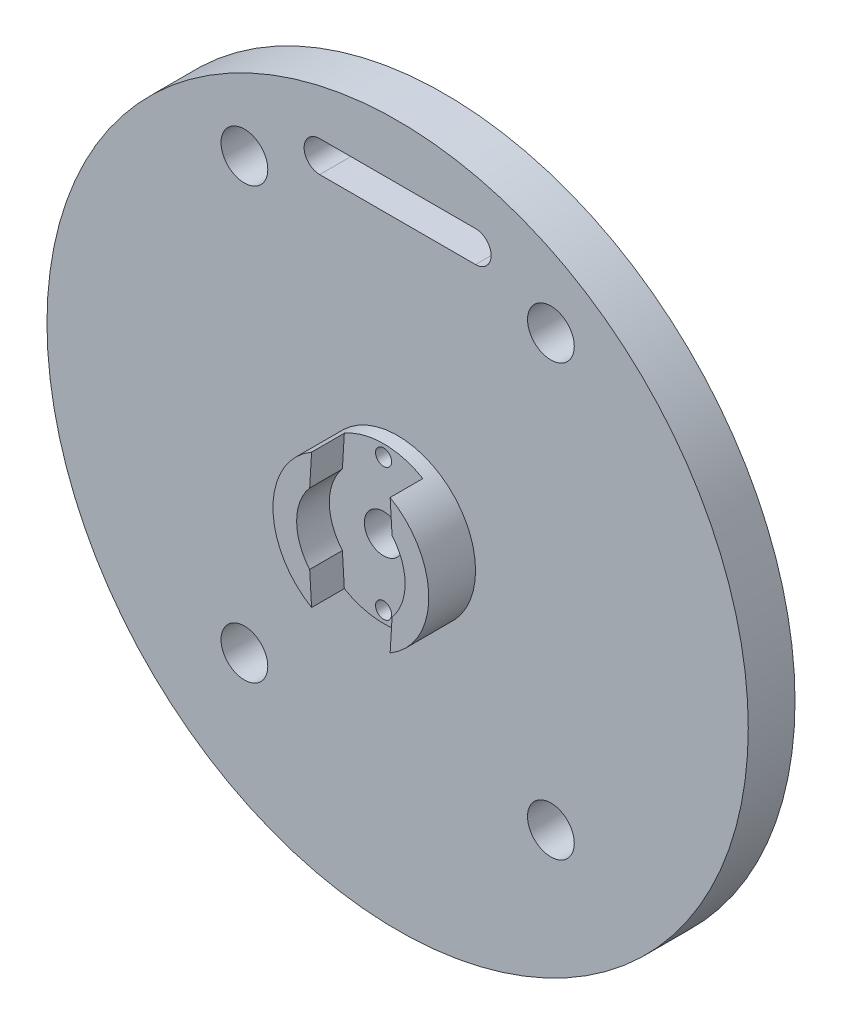
ISO-10303-21;
HEADER;
FILE_DESCRIPTION(('STEP AP214'),'2;1');
FILE_NAME('part.step','',(''),(''),'','','');
FILE_SCHEMA(('AUTOMOTIVE_DESIGN { 1 0 10303 214 1 1 1 1 }'));
ENDSEC;
DATA;
#1=APPLICATION_CONTEXT('core data for automotive mechanical design processes');
#2=APPLICATION_PROTOCOL_DEFINITION('international standard','automotive_design',2000,#1);
#3=PRODUCT_CONTEXT('',#1,'mechanical');
#4=PRODUCT('Part','Part','',(#3));
#5=PRODUCT_RELATED_PRODUCT_CATEGORY('part','',(#4));
#6=PRODUCT_DEFINITION_FORMATION('','',#4);
#7=PRODUCT_DEFINITION_CONTEXT('part definition',#1,'design');
#8=PRODUCT_DEFINITION('design','',#6,#7);
#9=PRODUCT_DEFINITION_SHAPE('','',#8);
#10=(LENGTH_UNIT() NAMED_UNIT(*) SI_UNIT(.MILLI.,.METRE.));
#11=(NAMED_UNIT(*) PLANE_ANGLE_UNIT() SI_UNIT($,.RADIAN.));
#12=(NAMED_UNIT(*) SI_UNIT($,.STERADIAN.) SOLID_ANGLE_UNIT());
#13=UNCERTAINTY_MEASURE_WITH_UNIT(LENGTH_MEASURE(1.E-05),#10,'distance_accuracy_value','');
#14=(GEOMETRIC_REPRESENTATION_CONTEXT(3) GLOBAL_UNCERTAINTY_ASSIGNED_CONTEXT((#13)) GLOBAL_UNIT_ASSIGNED_CONTEXT((#10,
#11,#12)) REPRESENTATION_CONTEXT('',''));
#15=CARTESIAN_POINT('',(0.,0.,0.));
#16=DIRECTION('',(0.,0.,1.));
#17=DIRECTION('',(1.,0.,0.));
#18=AXIS2_PLACEMENT_3D('',#15,#16,#17);
#19=CARTESIAN_POINT('',(0.,0.,6.));
#20=DIRECTION('',(0.,0.,1.));
#21=DIRECTION('',(1.,0.,0.));
#22=AXIS2_PLACEMENT_3D('',#19,#20,#21);
#23=PLANE('',#22);
#24=DIRECTION('',(-0.0600494730493308,0.99819540210647,0.));
#25=VECTOR('',#24,1.);
#26=CARTESIAN_POINT('',(2.51663581578155,4.37824670053271,6.));
#27=LINE('',#26,#25);
#28=CARTESIAN_POINT('',(2.64389771435228,2.26278697098131,6.));
#29=VERTEX_POINT('',#28);
#30=CARTESIAN_POINT('',(2.52023729154143,4.31837978810618,6.));
#31=VERTEX_POINT('',#30);
#32=EDGE_CURVE('E137',#29,#31,#27,.T.);
#33=ORIENTED_EDGE('',*,*,#32,.F.);
#34=CARTESIAN_POINT('',(0.,0.,6.));
#35=DIRECTION('',(0.,0.,1.));
#36=DIRECTION('',(-1.,0.,0.));
#37=AXIS2_PLACEMENT_3D('',#34,#35,#36);
#38=CIRCLE('',#37,3.47999999999999);
#39=CARTESIAN_POINT('',(2.64389771435228,-2.26278697098132,6.));
#40=VERTEX_POINT('',#39);
#41=EDGE_CURVE('E175',#40,#29,#38,.T.);
#42=ORIENTED_EDGE('',*,*,#41,.F.);
#43=DIRECTION('',(0.0600494730493309,0.99819540210647,0.));
#44=VECTOR('',#43,1.);
#45=CARTESIAN_POINT('',(2.76999793788258,-0.166637630434447,6.));
#46=LINE('',#45,#44);
#47=CARTESIAN_POINT('',(2.52023729154142,-4.31837978810618,6.));
#48=VERTEX_POINT('',#47);
#49=EDGE_CURVE('E276',#48,#40,#46,.T.);
#50=ORIENTED_EDGE('',*,*,#49,.F.);
#51=CARTESIAN_POINT('',(0.,0.,6.));
#52=DIRECTION('',(0.,0.,1.));
#53=DIRECTION('',(1.,0.,0.));
#54=AXIS2_PLACEMENT_3D('',#51,#52,#53);
#55=CIRCLE('',#54,5.);
#56=EDGE_CURVE('E258',#48,#31,#55,.T.);
#57=ORIENTED_EDGE('',*,*,#56,.T.);
#58=EDGE_LOOP('',(#33,#42,#50,#57));
#59=FACE_BOUND('',#58,.T.);
#60=ADVANCED_FACE('F39',(#59),#23,.T.);
#61=CARTESIAN_POINT('',(0.,0.,3.));
#62=DIRECTION('',(0.,0.,-1.));
#63=DIRECTION('',(-1.,0.,0.));
#64=AXIS2_PLACEMENT_3D('',#61,#62,#63);
#65=CYLINDRICAL_SURFACE('',#64,22.5);
#66=CARTESIAN_POINT('',(0.,0.,3.));
#67=DIRECTION('',(0.,0.,1.));
#68=DIRECTION('',(1.,0.,0.));
#69=AXIS2_PLACEMENT_3D('',#66,#67,#68);
#70=CIRCLE('',#69,22.5);
#71=CARTESIAN_POINT('',(22.5,0.,3.));
#72=VERTEX_POINT('',#71);
#73=EDGE_CURVE('E267',#72,#72,#70,.T.);
#74=ORIENTED_EDGE('',*,*,#73,.F.);
#75=EDGE_LOOP('',(#74));
#76=FACE_BOUND('',#75,.T.);
#77=CARTESIAN_POINT('',(0.,0.,0.));
#78=DIRECTION('',(0.,0.,1.));
#79=DIRECTION('',(1.,0.,0.));
#80=AXIS2_PLACEMENT_3D('',#77,#78,#79);
#81=CIRCLE('',#80,22.5);
#82=CARTESIAN_POINT('',(22.5,0.,0.));
#83=VERTEX_POINT('',#82);
#84=EDGE_CURVE('E271',#83,#83,#81,.T.);
#85=ORIENTED_EDGE('',*,*,#84,.T.);
#86=EDGE_LOOP('',(#85));
#87=FACE_BOUND('',#86,.T.);
#88=ADVANCED_FACE('F41',(#76,#87),#65,.T.);
#89=CARTESIAN_POINT('',(0.,0.,3.));
#90=DIRECTION('',(0.,0.,1.));
#91=DIRECTION('',(1.,0.,0.));
#92=AXIS2_PLACEMENT_3D('',#89,#90,#91);
#93=PLANE('',#92);
#94=CARTESIAN_POINT('',(9.83500000000232,15.6150000000002,3.));
#95=DIRECTION('',(0.,0.,1.));
#96=DIRECTION('',(1.,0.,0.));
#97=AXIS2_PLACEMENT_3D('',#94,#95,#96);
#98=CIRCLE('',#97,1.5);
#99=CARTESIAN_POINT('',(11.3350000000023,15.6150000000002,3.));
#100=VERTEX_POINT('',#99);
#101=EDGE_CURVE('E421',#100,#100,#98,.T.);
#102=ORIENTED_EDGE('',*,*,#101,.F.);
#103=EDGE_LOOP('',(#102));
#104=FACE_BOUND('',#103,.T.);
#105=CARTESIAN_POINT('',(-9.83124790355168,15.6150000000002,3.));
#106=DIRECTION('',(0.,0.,1.));
#107=DIRECTION('',(1.,0.,0.));
#108=AXIS2_PLACEMENT_3D('',#105,#106,#107);
#109=CIRCLE('',#108,1.5);
#110=CARTESIAN_POINT('',(-8.33124790355168,15.6150000000002,3.));
#111=VERTEX_POINT('',#110);
#112=EDGE_CURVE('E434',#111,#111,#109,.T.);
#113=ORIENTED_EDGE('',*,*,#112,.F.);
#114=EDGE_LOOP('',(#113));
#115=FACE_BOUND('',#114,.T.);
#116=CARTESIAN_POINT('',(9.83500000000002,-12.,3.));
#117=DIRECTION('',(0.,0.,1.));
#118=DIRECTION('',(1.,0.,0.));
#119=AXIS2_PLACEMENT_3D('',#116,#117,#118);
#120=CIRCLE('',#119,1.5);
#121=CARTESIAN_POINT('',(11.335,-12.,3.));
#122=VERTEX_POINT('',#121);
#123=EDGE_CURVE('E216',#122,#122,#120,.T.);
#124=ORIENTED_EDGE('',*,*,#123,.F.);
#125=EDGE_LOOP('',(#124));
#126=FACE_BOUND('',#125,.T.);
#127=CARTESIAN_POINT('',(-9.83124790355401,-12.,3.));
#128=DIRECTION('',(0.,0.,1.));
#129=DIRECTION('',(1.,0.,0.));
#130=AXIS2_PLACEMENT_3D('',#127,#128,#129);
#131=CIRCLE('',#130,1.5);
#132=CARTESIAN_POINT('',(-8.331247903554,-12.,3.));
#133=VERTEX_POINT('',#132);
#134=EDGE_CURVE('E209',#133,#133,#131,.T.);
#135=ORIENTED_EDGE('',*,*,#134,.F.);
#136=EDGE_LOOP('',(#135));
#137=FACE_BOUND('',#136,.T.);
#138=CARTESIAN_POINT('',(5.,18.,3.));
#139=DIRECTION('',(0.,0.,1.));
#140=DIRECTION('',(1.,0.,0.));
#141=AXIS2_PLACEMENT_3D('',#138,#139,#140);
#142=CIRCLE('',#141,0.999999999999997);
#143=CARTESIAN_POINT('',(5.,17.,3.));
#144=VERTEX_POINT('',#143);
#145=CARTESIAN_POINT('',(5.,19.,3.));
#146=VERTEX_POINT('',#145);
#147=EDGE_CURVE('E255',#144,#146,#142,.T.);
#148=ORIENTED_EDGE('',*,*,#147,.F.);
#149=DIRECTION('',(1.,0.,0.));
#150=VECTOR('',#149,1.);
#151=CARTESIAN_POINT('',(0.,17.,3.));
#152=LINE('',#151,#150);
#153=CARTESIAN_POINT('',(-5.,17.,3.));
#154=VERTEX_POINT('',#153);
#155=EDGE_CURVE('E238',#154,#144,#152,.T.);
#156=ORIENTED_EDGE('',*,*,#155,.F.);
#157=CARTESIAN_POINT('',(-5.,18.,3.));
#158=DIRECTION('',(0.,0.,1.));
#159=DIRECTION('',(1.,0.,0.));
#160=AXIS2_PLACEMENT_3D('',#157,#158,#159);
#161=CIRCLE('',#160,0.999999999999999);
#162=CARTESIAN_POINT('',(-5.,19.,3.));
#163=VERTEX_POINT('',#162);
#164=EDGE_CURVE('E249',#163,#154,#161,.T.);
#165=ORIENTED_EDGE('',*,*,#164,.F.);
#166=DIRECTION('',(-1.,0.,0.));
#167=VECTOR('',#166,1.);
#168=CARTESIAN_POINT('',(0.,19.,3.));
#169=LINE('',#168,#167);
#170=EDGE_CURVE('E252',#146,#163,#169,.T.);
#171=ORIENTED_EDGE('',*,*,#170,.F.);
#172=EDGE_LOOP('',(#148,#156,#165,#171));
#173=FACE_BOUND('',#172,.T.);
#174=CARTESIAN_POINT('',(0.,0.,3.));
#175=DIRECTION('',(0.,0.,1.));
#176=DIRECTION('',(1.,0.,0.));
#177=AXIS2_PLACEMENT_3D('',#174,#175,#176);
#178=CIRCLE('',#177,5.);
#179=CARTESIAN_POINT('',(5.,0.,3.));
#180=VERTEX_POINT('',#179);
#181=EDGE_CURVE('E263',#180,#180,#178,.T.);
#182=ORIENTED_EDGE('',*,*,#181,.F.);
#183=EDGE_LOOP('',(#182));
#184=FACE_BOUND('',#183,.T.);
#185=ORIENTED_EDGE('',*,*,#73,.T.);
#186=EDGE_LOOP('',(#185));
#187=FACE_BOUND('',#186,.T.);
#188=ADVANCED_FACE('F316',(#104,#115,#126,#137,#173,#184,#187),#93,.T.);
#189=CARTESIAN_POINT('',(0.,0.,0.));
#190=DIRECTION('',(0.,0.,1.));
#191=DIRECTION('',(1.,0.,0.));
#192=AXIS2_PLACEMENT_3D('',#189,#190,#191);
#193=PLANE('',#192);
#194=CARTESIAN_POINT('',(9.83500000000232,15.6150000000002,0.));
#195=DIRECTION('',(0.,0.,-1.));
#196=DIRECTION('',(-1.,0.,0.));
#197=AXIS2_PLACEMENT_3D('',#194,#195,#196);
#198=CIRCLE('',#197,1.5);
#199=CARTESIAN_POINT('',(8.33500000000232,15.6150000000002,0.));
#200=VERTEX_POINT('',#199);
#201=EDGE_CURVE('E390',#200,#200,#198,.T.);
#202=ORIENTED_EDGE('',*,*,#201,.F.);
#203=EDGE_LOOP('',(#202));
#204=FACE_BOUND('',#203,.T.);
#205=CARTESIAN_POINT('',(-9.83124790355168,15.6150000000002,0.));
#206=DIRECTION('',(0.,0.,-1.));
#207=DIRECTION('',(-1.,0.,0.));
#208=AXIS2_PLACEMENT_3D('',#205,#206,#207);
#209=CIRCLE('',#208,1.5);
#210=CARTESIAN_POINT('',(-11.3312479035517,15.6150000000002,0.));
#211=VERTEX_POINT('',#210);
#212=EDGE_CURVE('E394',#211,#211,#209,.T.);
#213=ORIENTED_EDGE('',*,*,#212,.F.);
#214=EDGE_LOOP('',(#213));
#215=FACE_BOUND('',#214,.T.);
#216=CARTESIAN_POINT('',(0.,4.25,0.));
#217=DIRECTION('',(0.,0.,1.));
#218=DIRECTION('',(1.,0.,0.));
#219=AXIS2_PLACEMENT_3D('',#216,#217,#218);
#220=CIRCLE('',#219,0.515);
#221=CARTESIAN_POINT('',(0.515,4.25,0.));
#222=VERTEX_POINT('',#221);
#223=EDGE_CURVE('E172',#222,#222,#220,.T.);
#224=ORIENTED_EDGE('',*,*,#223,.T.);
#225=EDGE_LOOP('',(#224));
#226=FACE_BOUND('',#225,.T.);
#227=CARTESIAN_POINT('',(0.,0.,0.));
#228=DIRECTION('',(0.,0.,1.));
#229=DIRECTION('',(1.,0.,0.));
#230=AXIS2_PLACEMENT_3D('',#227,#228,#229);
#231=CIRCLE('',#230,1.235);
#232=CARTESIAN_POINT('',(1.235,0.,0.));
#233=VERTEX_POINT('',#232);
#234=EDGE_CURVE('E401',#233,#233,#231,.T.);
#235=ORIENTED_EDGE('',*,*,#234,.T.);
#236=EDGE_LOOP('',(#235));
#237=FACE_BOUND('',#236,.T.);
#238=CARTESIAN_POINT('',(0.,-4.25,0.));
#239=DIRECTION('',(0.,0.,1.));
#240=DIRECTION('',(1.,0.,0.));
#241=AXIS2_PLACEMENT_3D('',#238,#239,#240);
#242=CIRCLE('',#241,0.514999999999999);
#243=CARTESIAN_POINT('',(0.515000000000001,-4.25,0.));
#244=VERTEX_POINT('',#243);
#245=EDGE_CURVE('E405',#244,#244,#242,.T.);
#246=ORIENTED_EDGE('',*,*,#245,.T.);
#247=EDGE_LOOP('',(#246));
#248=FACE_BOUND('',#247,.T.);
#249=CARTESIAN_POINT('',(9.83500000000002,-12.,0.));
#250=DIRECTION('',(0.,0.,-1.));
#251=DIRECTION('',(-1.,0.,0.));
#252=AXIS2_PLACEMENT_3D('',#249,#250,#251);
#253=CIRCLE('',#252,1.5);
#254=CARTESIAN_POINT('',(8.33500000000001,-12.,0.));
#255=VERTEX_POINT('',#254);
#256=EDGE_CURVE('E205',#255,#255,#253,.T.);
#257=ORIENTED_EDGE('',*,*,#256,.F.);
#258=EDGE_LOOP('',(#257));
#259=FACE_BOUND('',#258,.T.);
#260=CARTESIAN_POINT('',(-9.83124790355401,-12.,0.));
#261=DIRECTION('',(0.,0.,-1.));
#262=DIRECTION('',(-1.,0.,0.));
#263=AXIS2_PLACEMENT_3D('',#260,#261,#262);
#264=CIRCLE('',#263,1.5);
#265=CARTESIAN_POINT('',(-11.331247903554,-12.,0.));
#266=VERTEX_POINT('',#265);
#267=EDGE_CURVE('E204',#266,#266,#264,.T.);
#268=ORIENTED_EDGE('',*,*,#267,.F.);
#269=EDGE_LOOP('',(#268));
#270=FACE_BOUND('',#269,.T.);
#271=DIRECTION('',(-1.,0.,0.));
#272=VECTOR('',#271,1.);
#273=CARTESIAN_POINT('',(5.,17.,0.));
#274=LINE('',#273,#272);
#275=CARTESIAN_POINT('',(5.,17.,0.));
#276=VERTEX_POINT('',#275);
#277=CARTESIAN_POINT('',(-5.,17.,0.));
#278=VERTEX_POINT('',#277);
#279=EDGE_CURVE('E223',#276,#278,#274,.T.);
#280=ORIENTED_EDGE('',*,*,#279,.F.);
#281=CARTESIAN_POINT('',(5.,18.,0.));
#282=DIRECTION('',(0.,0.,-1.));
#283=DIRECTION('',(-1.,0.,0.));
#284=AXIS2_PLACEMENT_3D('',#281,#282,#283);
#285=CIRCLE('',#284,0.999999999999997);
#286=CARTESIAN_POINT('',(5.,19.,0.));
#287=VERTEX_POINT('',#286);
#288=EDGE_CURVE('E220',#287,#276,#285,.T.);
#289=ORIENTED_EDGE('',*,*,#288,.F.);
#290=DIRECTION('',(1.,0.,0.));
#291=VECTOR('',#290,1.);
#292=CARTESIAN_POINT('',(5.,19.,0.));
#293=LINE('',#292,#291);
#294=CARTESIAN_POINT('',(-5.,19.,0.));
#295=VERTEX_POINT('',#294);
#296=EDGE_CURVE('E230',#295,#287,#293,.T.);
#297=ORIENTED_EDGE('',*,*,#296,.F.);
#298=CARTESIAN_POINT('',(-5.,18.,0.));
#299=DIRECTION('',(0.,0.,-1.));
#300=DIRECTION('',(-1.,0.,0.));
#301=AXIS2_PLACEMENT_3D('',#298,#299,#300);
#302=CIRCLE('',#301,0.999999999999999);
#303=EDGE_CURVE('E226',#278,#295,#302,.T.);
#304=ORIENTED_EDGE('',*,*,#303,.F.);
#305=EDGE_LOOP('',(#280,#289,#297,#304));
#306=FACE_BOUND('',#305,.T.);
#307=ORIENTED_EDGE('',*,*,#84,.F.);
#308=EDGE_LOOP('',(#307));
#309=FACE_BOUND('',#308,.T.);
#310=ADVANCED_FACE('F329',(#204,#215,#226,#237,#248,#259,#270,#306,#309),#193,.F.);
#311=CARTESIAN_POINT('',(0.,0.,6.));
#312=DIRECTION('',(0.,0.,-1.));
#313=DIRECTION('',(-1.,0.,0.));
#314=AXIS2_PLACEMENT_3D('',#311,#312,#313);
#315=CYLINDRICAL_SURFACE('',#314,5.);
#316=CARTESIAN_POINT('',(0.,0.,3.9));
#317=DIRECTION('',(0.,0.,1.));
#318=DIRECTION('',(1.,0.,0.));
#319=AXIS2_PLACEMENT_3D('',#316,#317,#318);
#320=CIRCLE('',#319,5.);
#321=CARTESIAN_POINT('',(2.52023729154142,4.31837978810618,3.9));
#322=VERTEX_POINT('',#321);
#323=CARTESIAN_POINT('',(-2.52023729154143,4.31837978810618,3.9));
#324=VERTEX_POINT('',#323);
#325=EDGE_CURVE('E11',#322,#324,#320,.T.);
#326=ORIENTED_EDGE('',*,*,#325,.F.);
#327=DIRECTION('',(0.,0.,-1.));
#328=VECTOR('',#327,1.);
#329=CARTESIAN_POINT('',(2.52023729154143,4.31837978810618,6.));
#330=LINE('',#329,#328);
#331=EDGE_CURVE('E200',#322,#31,#330,.F.);
#332=ORIENTED_EDGE('',*,*,#331,.T.);
#333=ORIENTED_EDGE('',*,*,#56,.F.);
#334=DIRECTION('',(0.,0.,-1.));
#335=VECTOR('',#334,1.);
#336=CARTESIAN_POINT('',(2.52023729154142,-4.31837978810618,6.));
#337=LINE('',#336,#335);
#338=CARTESIAN_POINT('',(2.52023729154142,-4.31837978810618,3.9));
#339=VERTEX_POINT('',#338);
#340=EDGE_CURVE('E196',#48,#339,#337,.T.);
#341=ORIENTED_EDGE('',*,*,#340,.T.);
#342=CARTESIAN_POINT('',(-2.52023729154142,-4.31837978810618,3.9));
#343=VERTEX_POINT('',#342);
#344=EDGE_CURVE('E43',#343,#339,#320,.T.);
#345=ORIENTED_EDGE('',*,*,#344,.F.);
#346=DIRECTION('',(0.,0.,-1.));
#347=VECTOR('',#346,1.);
#348=CARTESIAN_POINT('',(-2.52023729154142,-4.31837978810618,6.));
#349=LINE('',#348,#347);
#350=CARTESIAN_POINT('',(-2.52023729154142,-4.31837978810618,6.));
#351=VERTEX_POINT('',#350);
#352=EDGE_CURVE('E192',#343,#351,#349,.F.);
#353=ORIENTED_EDGE('',*,*,#352,.T.);
#354=CARTESIAN_POINT('',(-2.52023729154143,4.31837978810618,6.));
#355=VERTEX_POINT('',#354);
#356=EDGE_CURVE('E262',#355,#351,#55,.T.);
#357=ORIENTED_EDGE('',*,*,#356,.F.);
#358=DIRECTION('',(0.,0.,-1.));
#359=VECTOR('',#358,1.);
#360=CARTESIAN_POINT('',(-2.52023729154143,4.31837978810618,6.));
#361=LINE('',#360,#359);
#362=EDGE_CURVE('E55',#355,#324,#361,.T.);
#363=ORIENTED_EDGE('',*,*,#362,.T.);
#364=EDGE_LOOP('',(#326,#332,#333,#341,#345,#353,#357,#363));
#365=FACE_BOUND('',#364,.T.);
#366=ORIENTED_EDGE('',*,*,#181,.T.);
#367=EDGE_LOOP('',(#366));
#368=FACE_BOUND('',#367,.T.);
#369=ADVANCED_FACE('F288',(#365,#368),#315,.T.);
#370=DIRECTION('',(0.0600494730493307,-0.99819540210647,0.));
#371=VECTOR('',#370,1.);
#372=CARTESIAN_POINT('',(-2.64389771435228,-2.26278697098132,6.));
#373=LINE('',#372,#371);
#374=CARTESIAN_POINT('',(-2.64389771435228,-2.26278697098132,6.));
#375=VERTEX_POINT('',#374);
#376=EDGE_CURVE('E171',#375,#351,#373,.T.);
#377=ORIENTED_EDGE('',*,*,#376,.F.);
#378=CARTESIAN_POINT('',(0.,0.,6.));
#379=DIRECTION('',(0.,0.,1.));
#380=DIRECTION('',(1.,0.,0.));
#381=AXIS2_PLACEMENT_3D('',#378,#379,#380);
#382=CIRCLE('',#381,3.48000000000001);
#383=CARTESIAN_POINT('',(-2.64389771435228,2.26278697098131,6.));
#384=VERTEX_POINT('',#383);
#385=EDGE_CURVE('E168',#384,#375,#382,.T.);
#386=ORIENTED_EDGE('',*,*,#385,.F.);
#387=DIRECTION('',(-0.0600494730493306,-0.99819540210647,0.));
#388=VECTOR('',#387,1.);
#389=CARTESIAN_POINT('',(-2.76999793788258,0.166637630434446,6.));
#390=LINE('',#389,#388);
#391=EDGE_CURVE('E142',#355,#384,#390,.T.);
#392=ORIENTED_EDGE('',*,*,#391,.F.);
#393=ORIENTED_EDGE('',*,*,#356,.T.);
#394=EDGE_LOOP('',(#377,#386,#392,#393));
#395=FACE_BOUND('',#394,.T.);
#396=ADVANCED_FACE('F312',(#395),#23,.T.);
#397=CARTESIAN_POINT('',(5.,18.,10.));
#398=DIRECTION('',(0.,0.,-1.));
#399=DIRECTION('',(-1.,0.,0.));
#400=AXIS2_PLACEMENT_3D('',#397,#398,#399);
#401=CYLINDRICAL_SURFACE('',#400,0.999999999999997);
#402=ORIENTED_EDGE('',*,*,#147,.T.);
#403=DIRECTION('',(0.,0.,-1.));
#404=VECTOR('',#403,1.);
#405=CARTESIAN_POINT('',(5.,19.,10.));
#406=LINE('',#405,#404);
#407=EDGE_CURVE('E235',#146,#287,#406,.T.);
#408=ORIENTED_EDGE('',*,*,#407,.T.);
#409=ORIENTED_EDGE('',*,*,#288,.T.);
#410=DIRECTION('',(0.,0.,-1.));
#411=VECTOR('',#410,1.);
#412=CARTESIAN_POINT('',(5.,17.,10.));
#413=LINE('',#412,#411);
#414=EDGE_CURVE('E234',#144,#276,#413,.T.);
#415=ORIENTED_EDGE('',*,*,#414,.F.);
#416=EDGE_LOOP('',(#402,#408,#409,#415));
#417=FACE_BOUND('',#416,.T.);
#418=ADVANCED_FACE('F321',(#417),#401,.F.);
#419=CARTESIAN_POINT('',(5.,19.,10.));
#420=DIRECTION('',(0.,1.,0.));
#421=DIRECTION('',(-1.,0.,0.));
#422=AXIS2_PLACEMENT_3D('',#419,#420,#421);
#423=PLANE('',#422);
#424=ORIENTED_EDGE('',*,*,#170,.T.);
#425=DIRECTION('',(0.,0.,-1.));
#426=VECTOR('',#425,1.);
#427=CARTESIAN_POINT('',(-5.,19.,10.));
#428=LINE('',#427,#426);
#429=EDGE_CURVE('E239',#163,#295,#428,.T.);
#430=ORIENTED_EDGE('',*,*,#429,.T.);
#431=ORIENTED_EDGE('',*,*,#296,.T.);
#432=ORIENTED_EDGE('',*,*,#407,.F.);
#433=EDGE_LOOP('',(#424,#430,#431,#432));
#434=FACE_BOUND('',#433,.T.);
#435=ADVANCED_FACE('F327',(#434),#423,.F.);
#436=CARTESIAN_POINT('',(-5.,18.,10.));
#437=DIRECTION('',(0.,0.,-1.));
#438=DIRECTION('',(-1.,0.,0.));
#439=AXIS2_PLACEMENT_3D('',#436,#437,#438);
#440=CYLINDRICAL_SURFACE('',#439,0.999999999999999);
#441=ORIENTED_EDGE('',*,*,#164,.T.);
#442=DIRECTION('',(0.,0.,-1.));
#443=VECTOR('',#442,1.);
#444=CARTESIAN_POINT('',(-5.,17.,10.));
#445=LINE('',#444,#443);
#446=EDGE_CURVE('E63',#154,#278,#445,.T.);
#447=ORIENTED_EDGE('',*,*,#446,.T.);
#448=ORIENTED_EDGE('',*,*,#303,.T.);
#449=ORIENTED_EDGE('',*,*,#429,.F.);
#450=EDGE_LOOP('',(#441,#447,#448,#449));
#451=FACE_BOUND('',#450,.T.);
#452=ADVANCED_FACE('F355',(#451),#440,.F.);
#453=CARTESIAN_POINT('',(5.,17.,10.));
#454=DIRECTION('',(0.,-1.,0.));
#455=DIRECTION('',(0.,0.,-1.));
#456=AXIS2_PLACEMENT_3D('',#453,#454,#455);
#457=PLANE('',#456);
#458=ORIENTED_EDGE('',*,*,#155,.T.);
#459=ORIENTED_EDGE('',*,*,#414,.T.);
#460=ORIENTED_EDGE('',*,*,#279,.T.);
#461=ORIENTED_EDGE('',*,*,#446,.F.);
#462=EDGE_LOOP('',(#458,#459,#460,#461));
#463=FACE_BOUND('',#462,.T.);
#464=ADVANCED_FACE('F351',(#463),#457,.F.);
#465=CARTESIAN_POINT('',(-9.83124790355401,-12.,10.));
#466=DIRECTION('',(0.,0.,-1.));
#467=DIRECTION('',(-1.,0.,0.));
#468=AXIS2_PLACEMENT_3D('',#465,#466,#467);
#469=CYLINDRICAL_SURFACE('',#468,1.5);
#470=ORIENTED_EDGE('',*,*,#134,.T.);
#471=EDGE_LOOP('',(#470));
#472=FACE_BOUND('',#471,.T.);
#473=ORIENTED_EDGE('',*,*,#267,.T.);
#474=EDGE_LOOP('',(#473));
#475=FACE_BOUND('',#474,.T.);
#476=ADVANCED_FACE('F347',(#472,#475),#469,.F.);
#477=CARTESIAN_POINT('',(9.83500000000002,-12.,10.));
#478=DIRECTION('',(0.,0.,-1.));
#479=DIRECTION('',(-1.,0.,0.));
#480=AXIS2_PLACEMENT_3D('',#477,#478,#479);
#481=CYLINDRICAL_SURFACE('',#480,1.5);
#482=ORIENTED_EDGE('',*,*,#123,.T.);
#483=EDGE_LOOP('',(#482));
#484=FACE_BOUND('',#483,.T.);
#485=ORIENTED_EDGE('',*,*,#256,.T.);
#486=EDGE_LOOP('',(#485));
#487=FACE_BOUND('',#486,.T.);
#488=ADVANCED_FACE('F306',(#484,#487),#481,.F.);
#489=CARTESIAN_POINT('',(0.,0.,3.9));
#490=DIRECTION('',(0.,0.,1.));
#491=DIRECTION('',(1.,0.,0.));
#492=AXIS2_PLACEMENT_3D('',#489,#490,#491);
#493=PLANE('',#492);
#494=CARTESIAN_POINT('',(0.,4.25,3.9));
#495=DIRECTION('',(0.,0.,1.));
#496=DIRECTION('',(1.,0.,0.));
#497=AXIS2_PLACEMENT_3D('',#494,#495,#496);
#498=CIRCLE('',#497,0.515);
#499=CARTESIAN_POINT('',(0.515,4.25,3.9));
#500=VERTEX_POINT('',#499);
#501=EDGE_CURVE('E425',#500,#500,#498,.T.);
#502=ORIENTED_EDGE('',*,*,#501,.F.);
#503=EDGE_LOOP('',(#502));
#504=FACE_BOUND('',#503,.T.);
#505=CARTESIAN_POINT('',(0.,0.,3.9));
#506=DIRECTION('',(0.,0.,1.));
#507=DIRECTION('',(1.,0.,0.));
#508=AXIS2_PLACEMENT_3D('',#505,#506,#507);
#509=CIRCLE('',#508,1.235);
#510=CARTESIAN_POINT('',(1.235,0.,3.9));
#511=VERTEX_POINT('',#510);
#512=EDGE_CURVE('E413',#511,#511,#509,.T.);
#513=ORIENTED_EDGE('',*,*,#512,.F.);
#514=EDGE_LOOP('',(#513));
#515=FACE_BOUND('',#514,.T.);
#516=CARTESIAN_POINT('',(0.,-4.25,3.9));
#517=DIRECTION('',(0.,0.,1.));
#518=DIRECTION('',(1.,0.,0.));
#519=AXIS2_PLACEMENT_3D('',#516,#517,#518);
#520=CIRCLE('',#519,0.514999999999999);
#521=CARTESIAN_POINT('',(0.515000000000001,-4.25,3.9));
#522=VERTEX_POINT('',#521);
#523=EDGE_CURVE('E414',#522,#522,#520,.T.);
#524=ORIENTED_EDGE('',*,*,#523,.F.);
#525=EDGE_LOOP('',(#524));
#526=FACE_BOUND('',#525,.T.);
#527=ORIENTED_EDGE('',*,*,#325,.T.);
#528=DIRECTION('',(-0.0600494730493306,-0.99819540210647,0.));
#529=VECTOR('',#528,1.);
#530=CARTESIAN_POINT('',(-2.51663581578155,4.37824670053271,3.9));
#531=LINE('',#530,#529);
#532=CARTESIAN_POINT('',(-2.64389771435228,2.26278697098131,3.9));
#533=VERTEX_POINT('',#532);
#534=EDGE_CURVE('E128',#324,#533,#531,.T.);
#535=ORIENTED_EDGE('',*,*,#534,.T.);
#536=CARTESIAN_POINT('',(0.,0.,3.9));
#537=DIRECTION('',(0.,0.,1.));
#538=DIRECTION('',(1.,0.,0.));
#539=AXIS2_PLACEMENT_3D('',#536,#537,#538);
#540=CIRCLE('',#539,3.48000000000001);
#541=CARTESIAN_POINT('',(-2.64389771435228,-2.26278697098132,3.9));
#542=VERTEX_POINT('',#541);
#543=EDGE_CURVE('E133',#533,#542,#540,.T.);
#544=ORIENTED_EDGE('',*,*,#543,.T.);
#545=DIRECTION('',(0.0600494730493307,-0.99819540210647,0.));
#546=VECTOR('',#545,1.);
#547=CARTESIAN_POINT('',(-2.64389771435228,-2.26278697098132,3.9));
#548=LINE('',#547,#546);
#549=EDGE_CURVE('E153',#542,#343,#548,.T.);
#550=ORIENTED_EDGE('',*,*,#549,.T.);
#551=ORIENTED_EDGE('',*,*,#344,.T.);
#552=DIRECTION('',(0.0600494730493309,0.99819540210647,0.));
#553=VECTOR('',#552,1.);
#554=CARTESIAN_POINT('',(2.64389771435228,-2.26278697098132,3.9));
#555=LINE('',#554,#553);
#556=CARTESIAN_POINT('',(2.64389771435228,-2.26278697098132,3.9));
#557=VERTEX_POINT('',#556);
#558=EDGE_CURVE('E156',#339,#557,#555,.T.);
#559=ORIENTED_EDGE('',*,*,#558,.T.);
#560=CARTESIAN_POINT('',(0.,0.,3.9));
#561=DIRECTION('',(0.,0.,1.));
#562=DIRECTION('',(-1.,0.,0.));
#563=AXIS2_PLACEMENT_3D('',#560,#561,#562);
#564=CIRCLE('',#563,3.47999999999999);
#565=CARTESIAN_POINT('',(2.64389771435228,2.26278697098131,3.9));
#566=VERTEX_POINT('',#565);
#567=EDGE_CURVE('E162',#557,#566,#564,.T.);
#568=ORIENTED_EDGE('',*,*,#567,.T.);
#569=DIRECTION('',(-0.0600494730493308,0.99819540210647,0.));
#570=VECTOR('',#569,1.);
#571=CARTESIAN_POINT('',(2.51663581578155,4.37824670053271,3.9));
#572=LINE('',#571,#570);
#573=EDGE_CURVE('E148',#566,#322,#572,.T.);
#574=ORIENTED_EDGE('',*,*,#573,.T.);
#575=EDGE_LOOP('',(#527,#535,#544,#550,#551,#559,#568,#574));
#576=FACE_BOUND('',#575,.T.);
#577=ADVANCED_FACE('F130',(#504,#515,#526,#576),#493,.T.);
#578=CARTESIAN_POINT('',(2.51663581578155,4.37824670053271,3.9));
#579=DIRECTION('',(0.99819540210647,0.0600494730493308,0.));
#580=DIRECTION('',(-0.0600494730493308,0.99819540210647,0.));
#581=AXIS2_PLACEMENT_3D('',#578,#579,#580);
#582=PLANE('',#581);
#583=ORIENTED_EDGE('',*,*,#573,.F.);
#584=DIRECTION('',(0.,0.,1.));
#585=VECTOR('',#584,1.);
#586=CARTESIAN_POINT('',(2.64389771435228,2.26278697098131,3.9));
#587=LINE('',#586,#585);
#588=EDGE_CURVE('E181',#566,#29,#587,.T.);
#589=ORIENTED_EDGE('',*,*,#588,.T.);
#590=ORIENTED_EDGE('',*,*,#32,.T.);
#591=ORIENTED_EDGE('',*,*,#331,.F.);
#592=EDGE_LOOP('',(#583,#589,#590,#591));
#593=FACE_BOUND('',#592,.T.);
#594=ADVANCED_FACE('F297',(#593),#582,.F.);
#595=CARTESIAN_POINT('',(2.64389771435228,-2.26278697098132,3.9));
#596=DIRECTION('',(0.99819540210647,-0.0600494730493309,0.));
#597=DIRECTION('',(0.0600494730493309,0.99819540210647,0.));
#598=AXIS2_PLACEMENT_3D('',#595,#596,#597);
#599=PLANE('',#598);
#600=ORIENTED_EDGE('',*,*,#49,.T.);
#601=DIRECTION('',(0.,0.,1.));
#602=VECTOR('',#601,1.);
#603=CARTESIAN_POINT('',(2.64389771435228,-2.26278697098132,3.9));
#604=LINE('',#603,#602);
#605=EDGE_CURVE('E184',#557,#40,#604,.T.);
#606=ORIENTED_EDGE('',*,*,#605,.F.);
#607=ORIENTED_EDGE('',*,*,#558,.F.);
#608=ORIENTED_EDGE('',*,*,#340,.F.);
#609=EDGE_LOOP('',(#600,#606,#607,#608));
#610=FACE_BOUND('',#609,.T.);
#611=ADVANCED_FACE('F285',(#610),#599,.F.);
#612=CARTESIAN_POINT('',(-2.64389771435228,-2.26278697098132,3.9));
#613=DIRECTION('',(-0.99819540210647,-0.0600494730493307,0.));
#614=DIRECTION('',(0.0600494730493307,-0.99819540210647,0.));
#615=AXIS2_PLACEMENT_3D('',#612,#613,#614);
#616=PLANE('',#615);
#617=ORIENTED_EDGE('',*,*,#549,.F.);
#618=DIRECTION('',(0.,0.,1.));
#619=VECTOR('',#618,1.);
#620=CARTESIAN_POINT('',(-2.64389771435228,-2.26278697098132,3.9));
#621=LINE('',#620,#619);
#622=EDGE_CURVE('E147',#542,#375,#621,.T.);
#623=ORIENTED_EDGE('',*,*,#622,.T.);
#624=ORIENTED_EDGE('',*,*,#376,.T.);
#625=ORIENTED_EDGE('',*,*,#352,.F.);
#626=EDGE_LOOP('',(#617,#623,#624,#625));
#627=FACE_BOUND('',#626,.T.);
#628=ADVANCED_FACE('F304',(#627),#616,.F.);
#629=CARTESIAN_POINT('',(-2.51663581578155,4.37824670053271,3.9));
#630=DIRECTION('',(-0.99819540210647,0.0600494730493306,0.));
#631=DIRECTION('',(-0.0600494730493306,-0.99819540210647,0.));
#632=AXIS2_PLACEMENT_3D('',#629,#630,#631);
#633=PLANE('',#632);
#634=ORIENTED_EDGE('',*,*,#391,.T.);
#635=DIRECTION('',(0.,0.,1.));
#636=VECTOR('',#635,1.);
#637=CARTESIAN_POINT('',(-2.64389771435228,2.26278697098131,3.9));
#638=LINE('',#637,#636);
#639=EDGE_CURVE('E140',#533,#384,#638,.T.);
#640=ORIENTED_EDGE('',*,*,#639,.F.);
#641=ORIENTED_EDGE('',*,*,#534,.F.);
#642=ORIENTED_EDGE('',*,*,#362,.F.);
#643=EDGE_LOOP('',(#634,#640,#641,#642));
#644=FACE_BOUND('',#643,.T.);
#645=ADVANCED_FACE('F141',(#644),#633,.F.);
#646=CARTESIAN_POINT('',(0.,0.,3.9));
#647=DIRECTION('',(0.,0.,1.));
#648=DIRECTION('',(1.,0.,0.));
#649=AXIS2_PLACEMENT_3D('',#646,#647,#648);
#650=CYLINDRICAL_SURFACE('',#649,3.47999999999999);
#651=ORIENTED_EDGE('',*,*,#41,.T.);
#652=ORIENTED_EDGE('',*,*,#588,.F.);
#653=ORIENTED_EDGE('',*,*,#567,.F.);
#654=ORIENTED_EDGE('',*,*,#605,.T.);
#655=EDGE_LOOP('',(#651,#652,#653,#654));
#656=FACE_BOUND('',#655,.T.);
#657=ADVANCED_FACE('F294',(#656),#650,.F.);
#658=CARTESIAN_POINT('',(0.,0.,3.9));
#659=DIRECTION('',(0.,0.,1.));
#660=DIRECTION('',(1.,0.,0.));
#661=AXIS2_PLACEMENT_3D('',#658,#659,#660);
#662=CYLINDRICAL_SURFACE('',#661,3.48000000000001);
#663=ORIENTED_EDGE('',*,*,#385,.T.);
#664=ORIENTED_EDGE('',*,*,#622,.F.);
#665=ORIENTED_EDGE('',*,*,#543,.F.);
#666=ORIENTED_EDGE('',*,*,#639,.T.);
#667=EDGE_LOOP('',(#663,#664,#665,#666));
#668=FACE_BOUND('',#667,.T.);
#669=ADVANCED_FACE('F150',(#668),#662,.F.);
#670=CARTESIAN_POINT('',(0.,-4.25,0.));
#671=DIRECTION('',(0.,0.,1.));
#672=DIRECTION('',(1.,0.,0.));
#673=AXIS2_PLACEMENT_3D('',#670,#671,#672);
#674=CYLINDRICAL_SURFACE('',#673,0.514999999999999);
#675=ORIENTED_EDGE('',*,*,#245,.F.);
#676=EDGE_LOOP('',(#675));
#677=FACE_BOUND('',#676,.T.);
#678=ORIENTED_EDGE('',*,*,#523,.T.);
#679=EDGE_LOOP('',(#678));
#680=FACE_BOUND('',#679,.T.);
#681=ADVANCED_FACE('F343',(#677,#680),#674,.F.);
#682=CARTESIAN_POINT('',(0.,0.,0.));
#683=DIRECTION('',(0.,0.,1.));
#684=DIRECTION('',(1.,0.,0.));
#685=AXIS2_PLACEMENT_3D('',#682,#683,#684);
#686=CYLINDRICAL_SURFACE('',#685,1.235);
#687=ORIENTED_EDGE('',*,*,#234,.F.);
#688=EDGE_LOOP('',(#687));
#689=FACE_BOUND('',#688,.T.);
#690=ORIENTED_EDGE('',*,*,#512,.T.);
#691=EDGE_LOOP('',(#690));
#692=FACE_BOUND('',#691,.T.);
#693=ADVANCED_FACE('F456',(#689,#692),#686,.F.);
#694=CARTESIAN_POINT('',(0.,4.25,0.));
#695=DIRECTION('',(0.,0.,1.));
#696=DIRECTION('',(1.,0.,0.));
#697=AXIS2_PLACEMENT_3D('',#694,#695,#696);
#698=CYLINDRICAL_SURFACE('',#697,0.515);
#699=ORIENTED_EDGE('',*,*,#223,.F.);
#700=EDGE_LOOP('',(#699));
#701=FACE_BOUND('',#700,.T.);
#702=ORIENTED_EDGE('',*,*,#501,.T.);
#703=EDGE_LOOP('',(#702));
#704=FACE_BOUND('',#703,.T.);
#705=ADVANCED_FACE('F450',(#701,#704),#698,.F.);
#706=CARTESIAN_POINT('',(-9.83124790355168,15.6150000000002,6.));
#707=DIRECTION('',(0.,0.,-1.));
#708=DIRECTION('',(-1.,0.,0.));
#709=AXIS2_PLACEMENT_3D('',#706,#707,#708);
#710=CYLINDRICAL_SURFACE('',#709,1.5);
#711=ORIENTED_EDGE('',*,*,#112,.T.);
#712=EDGE_LOOP('',(#711));
#713=FACE_BOUND('',#712,.T.);
#714=ORIENTED_EDGE('',*,*,#212,.T.);
#715=EDGE_LOOP('',(#714));
#716=FACE_BOUND('',#715,.T.);
#717=ADVANCED_FACE('F444',(#713,#716),#710,.F.);
#718=CARTESIAN_POINT('',(9.83500000000232,15.6150000000002,6.));
#719=DIRECTION('',(0.,0.,-1.));
#720=DIRECTION('',(-1.,0.,0.));
#721=AXIS2_PLACEMENT_3D('',#718,#719,#720);
#722=CYLINDRICAL_SURFACE('',#721,1.5);
#723=ORIENTED_EDGE('',*,*,#101,.T.);
#724=EDGE_LOOP('',(#723));
#725=FACE_BOUND('',#724,.T.);
#726=ORIENTED_EDGE('',*,*,#201,.T.);
#727=EDGE_LOOP('',(#726));
#728=FACE_BOUND('',#727,.T.);
#729=ADVANCED_FACE('F442',(#725,#728),#722,.F.);
#730=CLOSED_SHELL('',(#60,#88,#188,#310,#369,#396,#418,#435,#452,#464,#476,#488,#577,#594,#611,
#628,#645,#657,#669,#681,#693,#705,#717,#729));
#731=MANIFOLD_SOLID_BREP('B2',#730);
#732=ADVANCED_BREP_SHAPE_REPRESENTATION('',(#18,#731),#14);
#733=SHAPE_DEFINITION_REPRESENTATION(#9,#732);
ENDSEC;
END-ISO-10303-21;
